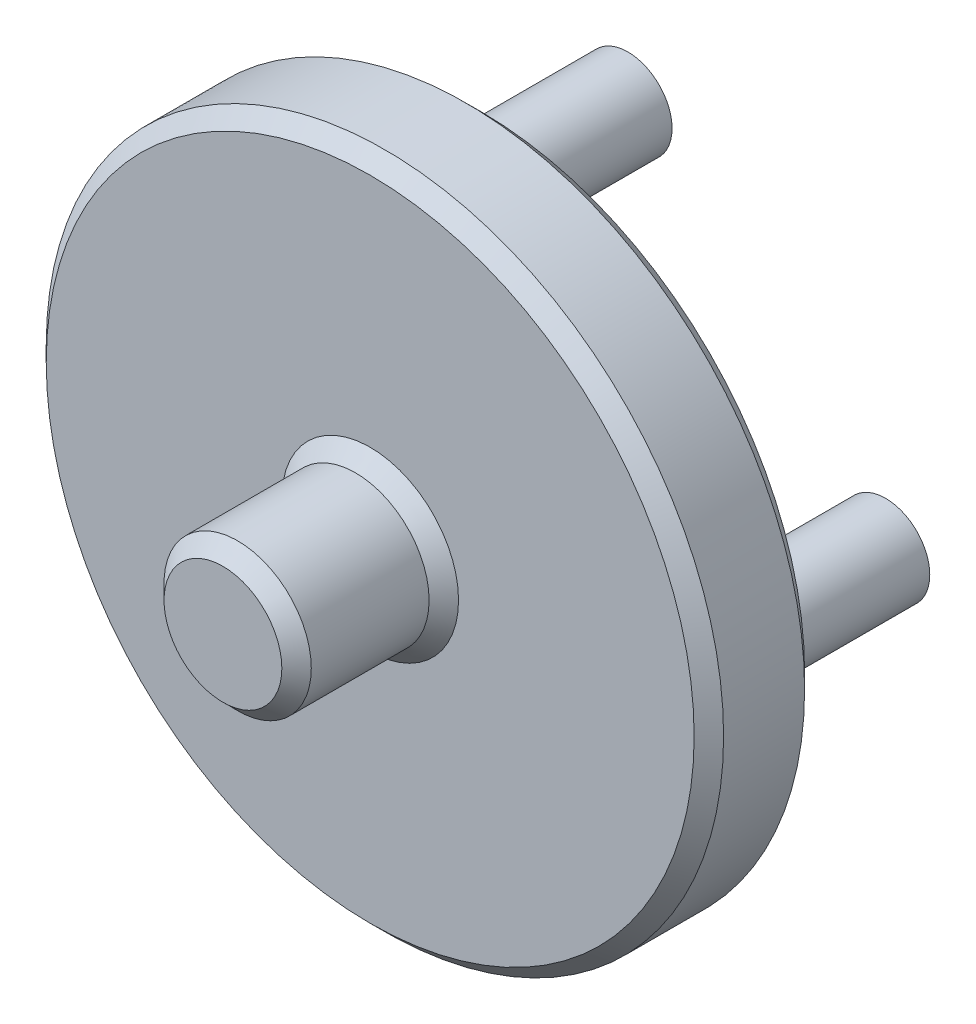
ISO-10303-21;
HEADER;
FILE_DESCRIPTION(('STEP AP214'),'2;1');
FILE_NAME('part.step','',(''),(''),'','','');
FILE_SCHEMA(('AUTOMOTIVE_DESIGN { 1 0 10303 214 1 1 1 1 }'));
ENDSEC;
DATA;
#1=APPLICATION_CONTEXT('core data for automotive mechanical design processes');
#2=APPLICATION_PROTOCOL_DEFINITION('international standard','automotive_design',2000,#1);
#3=PRODUCT_CONTEXT('',#1,'mechanical');
#4=PRODUCT('Part','Part','',(#3));
#5=PRODUCT_RELATED_PRODUCT_CATEGORY('part','',(#4));
#6=PRODUCT_DEFINITION_FORMATION('','',#4);
#7=PRODUCT_DEFINITION_CONTEXT('part definition',#1,'design');
#8=PRODUCT_DEFINITION('design','',#6,#7);
#9=PRODUCT_DEFINITION_SHAPE('','',#8);
#10=(LENGTH_UNIT() NAMED_UNIT(*) SI_UNIT(.MILLI.,.METRE.));
#11=(NAMED_UNIT(*) PLANE_ANGLE_UNIT() SI_UNIT($,.RADIAN.));
#12=(NAMED_UNIT(*) SI_UNIT($,.STERADIAN.) SOLID_ANGLE_UNIT());
#13=UNCERTAINTY_MEASURE_WITH_UNIT(LENGTH_MEASURE(1.E-05),#10,'distance_accuracy_value','');
#14=(GEOMETRIC_REPRESENTATION_CONTEXT(3) GLOBAL_UNCERTAINTY_ASSIGNED_CONTEXT((#13)) GLOBAL_UNIT_ASSIGNED_CONTEXT((#10,
#11,#12)) REPRESENTATION_CONTEXT('',''));
#15=CARTESIAN_POINT('',(0.,0.,0.));
#16=DIRECTION('',(0.,0.,1.));
#17=DIRECTION('',(1.,0.,0.));
#18=AXIS2_PLACEMENT_3D('',#15,#16,#17);
#19=CARTESIAN_POINT('',(0.,0.,7.5));
#20=DIRECTION('',(0.,0.,-1.));
#21=DIRECTION('',(-1.,0.,0.));
#22=AXIS2_PLACEMENT_3D('',#19,#20,#21);
#23=CYLINDRICAL_SURFACE('',#22,23.);
#24=CARTESIAN_POINT('',(0.,0.,1.00000000000001));
#25=DIRECTION('',(0.,0.,1.));
#26=DIRECTION('',(1.,0.,0.));
#27=AXIS2_PLACEMENT_3D('',#24,#25,#26);
#28=CIRCLE('',#27,23.);
#29=CARTESIAN_POINT('',(23.,0.,1.00000000000001));
#30=VERTEX_POINT('',#29);
#31=EDGE_CURVE('E10',#30,#30,#28,.T.);
#32=ORIENTED_EDGE('',*,*,#31,.T.);
#33=EDGE_LOOP('',(#32));
#34=FACE_BOUND('',#33,.T.);
#35=CARTESIAN_POINT('',(0.,0.,6.49999999999998));
#36=DIRECTION('',(0.,0.,1.));
#37=DIRECTION('',(1.,0.,0.));
#38=AXIS2_PLACEMENT_3D('',#35,#36,#37);
#39=CIRCLE('',#38,23.);
#40=CARTESIAN_POINT('',(23.,0.,6.49999999999998));
#41=VERTEX_POINT('',#40);
#42=EDGE_CURVE('E54',#41,#41,#39,.F.);
#43=ORIENTED_EDGE('',*,*,#42,.T.);
#44=EDGE_LOOP('',(#43));
#45=FACE_BOUND('',#44,.T.);
#46=ADVANCED_FACE('F45',(#34,#45),#23,.T.);
#47=CARTESIAN_POINT('',(0.,0.,7.5));
#48=DIRECTION('',(0.,0.,1.));
#49=DIRECTION('',(1.,0.,0.));
#50=AXIS2_PLACEMENT_3D('',#47,#48,#49);
#51=PLANE('',#50);
#52=CARTESIAN_POINT('',(0.,0.,7.5));
#53=DIRECTION('',(0.,0.,1.));
#54=DIRECTION('',(1.,0.,0.));
#55=AXIS2_PLACEMENT_3D('',#52,#53,#54);
#56=CIRCLE('',#55,6.00000000000001);
#57=CARTESIAN_POINT('',(6.00000000000001,0.,7.5));
#58=VERTEX_POINT('',#57);
#59=EDGE_CURVE('E98',#58,#58,#56,.F.);
#60=ORIENTED_EDGE('',*,*,#59,.T.);
#61=EDGE_LOOP('',(#60));
#62=FACE_BOUND('',#61,.T.);
#63=CARTESIAN_POINT('',(0.,0.,7.5));
#64=DIRECTION('',(0.,0.,1.));
#65=DIRECTION('',(1.,0.,0.));
#66=AXIS2_PLACEMENT_3D('',#63,#64,#65);
#67=CIRCLE('',#66,22.);
#68=CARTESIAN_POINT('',(22.,0.,7.5));
#69=VERTEX_POINT('',#68);
#70=EDGE_CURVE('E102',#69,#69,#67,.T.);
#71=ORIENTED_EDGE('',*,*,#70,.T.);
#72=EDGE_LOOP('',(#71));
#73=FACE_BOUND('',#72,.T.);
#74=ADVANCED_FACE('F153',(#62,#73),#51,.T.);
#75=CARTESIAN_POINT('',(0.,0.,0.));
#76=DIRECTION('',(0.,0.,1.));
#77=DIRECTION('',(1.,0.,0.));
#78=AXIS2_PLACEMENT_3D('',#75,#76,#77);
#79=PLANE('',#78);
#80=CARTESIAN_POINT('',(-1.2220184685951E-13,-17.5,0.));
#81=DIRECTION('',(0.,0.,1.));
#82=DIRECTION('',(1.,0.,0.));
#83=AXIS2_PLACEMENT_3D('',#80,#81,#82);
#84=CIRCLE('',#83,4.);
#85=CARTESIAN_POINT('',(3.99999999999988,-17.5,0.));
#86=VERTEX_POINT('',#85);
#87=EDGE_CURVE('E78',#86,#86,#84,.T.);
#88=ORIENTED_EDGE('',*,*,#87,.T.);
#89=EDGE_LOOP('',(#88));
#90=FACE_BOUND('',#89,.T.);
#91=CARTESIAN_POINT('',(-17.5,1.83302770289265E-13,0.));
#92=DIRECTION('',(0.,0.,1.));
#93=DIRECTION('',(1.,0.,0.));
#94=AXIS2_PLACEMENT_3D('',#91,#92,#93);
#95=CIRCLE('',#94,4.);
#96=CARTESIAN_POINT('',(-13.5,1.83302770289265E-13,0.));
#97=VERTEX_POINT('',#96);
#98=EDGE_CURVE('E82',#97,#97,#95,.T.);
#99=ORIENTED_EDGE('',*,*,#98,.T.);
#100=EDGE_LOOP('',(#99));
#101=FACE_BOUND('',#100,.T.);
#102=CARTESIAN_POINT('',(0.,17.5,0.));
#103=DIRECTION('',(0.,0.,1.));
#104=DIRECTION('',(1.,0.,0.));
#105=AXIS2_PLACEMENT_3D('',#102,#103,#104);
#106=CIRCLE('',#105,4.);
#107=CARTESIAN_POINT('',(4.,17.5,0.));
#108=VERTEX_POINT('',#107);
#109=EDGE_CURVE('E86',#108,#108,#106,.T.);
#110=ORIENTED_EDGE('',*,*,#109,.T.);
#111=EDGE_LOOP('',(#110));
#112=FACE_BOUND('',#111,.T.);
#113=CARTESIAN_POINT('',(17.5,0.,0.));
#114=DIRECTION('',(0.,0.,1.));
#115=DIRECTION('',(1.,0.,0.));
#116=AXIS2_PLACEMENT_3D('',#113,#114,#115);
#117=CIRCLE('',#116,4.);
#118=CARTESIAN_POINT('',(21.5,0.,0.));
#119=VERTEX_POINT('',#118);
#120=EDGE_CURVE('E90',#119,#119,#117,.T.);
#121=ORIENTED_EDGE('',*,*,#120,.T.);
#122=EDGE_LOOP('',(#121));
#123=FACE_BOUND('',#122,.T.);
#124=CARTESIAN_POINT('',(0.,0.,0.));
#125=DIRECTION('',(0.,0.,1.));
#126=DIRECTION('',(1.,0.,0.));
#127=AXIS2_PLACEMENT_3D('',#124,#125,#126);
#128=CIRCLE('',#127,22.);
#129=CARTESIAN_POINT('',(22.,0.,0.));
#130=VERTEX_POINT('',#129);
#131=EDGE_CURVE('E94',#130,#130,#128,.F.);
#132=ORIENTED_EDGE('',*,*,#131,.T.);
#133=EDGE_LOOP('',(#132));
#134=FACE_BOUND('',#133,.T.);
#135=ADVANCED_FACE('F158',(#90,#101,#112,#123,#134),#79,.F.);
#136=CARTESIAN_POINT('',(-17.5,1.83302770289265E-13,-10.));
#137=DIRECTION('',(0.,0.,1.));
#138=DIRECTION('',(1.,0.,0.));
#139=AXIS2_PLACEMENT_3D('',#136,#137,#138);
#140=CYLINDRICAL_SURFACE('',#139,3.);
#141=CARTESIAN_POINT('',(-17.5,1.83302770289265E-13,-1.));
#142=DIRECTION('',(0.,0.,1.));
#143=DIRECTION('',(1.,0.,0.));
#144=AXIS2_PLACEMENT_3D('',#141,#142,#143);
#145=CIRCLE('',#144,3.);
#146=CARTESIAN_POINT('',(-14.5,1.83302770289265E-13,-1.));
#147=VERTEX_POINT('',#146);
#148=EDGE_CURVE('E70',#147,#147,#145,.F.);
#149=ORIENTED_EDGE('',*,*,#148,.T.);
#150=EDGE_LOOP('',(#149));
#151=FACE_BOUND('',#150,.T.);
#152=CARTESIAN_POINT('',(-17.5,1.83302770289265E-13,-10.));
#153=DIRECTION('',(0.,0.,1.));
#154=DIRECTION('',(1.,0.,0.));
#155=AXIS2_PLACEMENT_3D('',#152,#153,#154);
#156=CIRCLE('',#155,3.);
#157=CARTESIAN_POINT('',(-14.5,1.83302770289265E-13,-10.));
#158=VERTEX_POINT('',#157);
#159=EDGE_CURVE('E119',#158,#158,#156,.T.);
#160=ORIENTED_EDGE('',*,*,#159,.T.);
#161=EDGE_LOOP('',(#160));
#162=FACE_BOUND('',#161,.T.);
#163=ADVANCED_FACE('F218',(#151,#162),#140,.T.);
#164=CARTESIAN_POINT('',(-17.5,1.83302770289265E-13,-10.));
#165=DIRECTION('',(0.,0.,1.));
#166=DIRECTION('',(1.,0.,0.));
#167=AXIS2_PLACEMENT_3D('',#164,#165,#166);
#168=PLANE('',#167);
#169=ORIENTED_EDGE('',*,*,#159,.F.);
#170=EDGE_LOOP('',(#169));
#171=FACE_BOUND('',#170,.T.);
#172=ADVANCED_FACE('F223',(#171),#168,.F.);
#173=CARTESIAN_POINT('',(-1.2220184685951E-13,-17.5,-10.));
#174=DIRECTION('',(0.,0.,1.));
#175=DIRECTION('',(1.,0.,0.));
#176=AXIS2_PLACEMENT_3D('',#173,#174,#175);
#177=CYLINDRICAL_SURFACE('',#176,3.);
#178=CARTESIAN_POINT('',(-1.2220184685951E-13,-17.5,-1.));
#179=DIRECTION('',(0.,0.,1.));
#180=DIRECTION('',(1.,0.,0.));
#181=AXIS2_PLACEMENT_3D('',#178,#179,#180);
#182=CIRCLE('',#181,3.);
#183=CARTESIAN_POINT('',(2.99999999999988,-17.5,-1.));
#184=VERTEX_POINT('',#183);
#185=EDGE_CURVE('E74',#184,#184,#182,.F.);
#186=ORIENTED_EDGE('',*,*,#185,.T.);
#187=EDGE_LOOP('',(#186));
#188=FACE_BOUND('',#187,.T.);
#189=CARTESIAN_POINT('',(-1.2220184685951E-13,-17.5,-10.));
#190=DIRECTION('',(0.,0.,1.));
#191=DIRECTION('',(1.,0.,0.));
#192=AXIS2_PLACEMENT_3D('',#189,#190,#191);
#193=CIRCLE('',#192,3.);
#194=CARTESIAN_POINT('',(2.99999999999988,-17.5,-10.));
#195=VERTEX_POINT('',#194);
#196=EDGE_CURVE('E123',#195,#195,#193,.T.);
#197=ORIENTED_EDGE('',*,*,#196,.T.);
#198=EDGE_LOOP('',(#197));
#199=FACE_BOUND('',#198,.T.);
#200=ADVANCED_FACE('F241',(#188,#199),#177,.T.);
#201=CARTESIAN_POINT('',(-1.2220184685951E-13,-17.5,-10.));
#202=DIRECTION('',(0.,0.,1.));
#203=DIRECTION('',(1.,0.,0.));
#204=AXIS2_PLACEMENT_3D('',#201,#202,#203);
#205=PLANE('',#204);
#206=ORIENTED_EDGE('',*,*,#196,.F.);
#207=EDGE_LOOP('',(#206));
#208=FACE_BOUND('',#207,.T.);
#209=ADVANCED_FACE('F246',(#208),#205,.F.);
#210=CARTESIAN_POINT('',(17.5,0.,-10.));
#211=DIRECTION('',(0.,0.,1.));
#212=DIRECTION('',(1.,0.,0.));
#213=AXIS2_PLACEMENT_3D('',#210,#211,#212);
#214=CYLINDRICAL_SURFACE('',#213,3.);
#215=CARTESIAN_POINT('',(17.5,0.,-1.));
#216=DIRECTION('',(0.,0.,1.));
#217=DIRECTION('',(1.,0.,0.));
#218=AXIS2_PLACEMENT_3D('',#215,#216,#217);
#219=CIRCLE('',#218,3.);
#220=CARTESIAN_POINT('',(20.5,0.,-1.));
#221=VERTEX_POINT('',#220);
#222=EDGE_CURVE('E59',#221,#221,#219,.F.);
#223=ORIENTED_EDGE('',*,*,#222,.T.);
#224=EDGE_LOOP('',(#223));
#225=FACE_BOUND('',#224,.T.);
#226=CARTESIAN_POINT('',(17.5,0.,-10.));
#227=DIRECTION('',(0.,0.,1.));
#228=DIRECTION('',(1.,0.,0.));
#229=AXIS2_PLACEMENT_3D('',#226,#227,#228);
#230=CIRCLE('',#229,3.);
#231=CARTESIAN_POINT('',(20.5,0.,-10.));
#232=VERTEX_POINT('',#231);
#233=EDGE_CURVE('E127',#232,#232,#230,.T.);
#234=ORIENTED_EDGE('',*,*,#233,.T.);
#235=EDGE_LOOP('',(#234));
#236=FACE_BOUND('',#235,.T.);
#237=ADVANCED_FACE('F249',(#225,#236),#214,.T.);
#238=CARTESIAN_POINT('',(17.5,0.,-10.));
#239=DIRECTION('',(0.,0.,1.));
#240=DIRECTION('',(1.,0.,0.));
#241=AXIS2_PLACEMENT_3D('',#238,#239,#240);
#242=PLANE('',#241);
#243=ORIENTED_EDGE('',*,*,#233,.F.);
#244=EDGE_LOOP('',(#243));
#245=FACE_BOUND('',#244,.T.);
#246=ADVANCED_FACE('F150',(#245),#242,.F.);
#247=CARTESIAN_POINT('',(0.,17.5,-10.));
#248=DIRECTION('',(0.,0.,1.));
#249=DIRECTION('',(1.,0.,0.));
#250=AXIS2_PLACEMENT_3D('',#247,#248,#249);
#251=CYLINDRICAL_SURFACE('',#250,3.);
#252=CARTESIAN_POINT('',(0.,17.5,-0.999999999999999));
#253=DIRECTION('',(0.,0.,1.));
#254=DIRECTION('',(1.,0.,0.));
#255=AXIS2_PLACEMENT_3D('',#252,#253,#254);
#256=CIRCLE('',#255,3.);
#257=CARTESIAN_POINT('',(3.,17.5,-0.999999999999999));
#258=VERTEX_POINT('',#257);
#259=EDGE_CURVE('E64',#258,#258,#256,.F.);
#260=ORIENTED_EDGE('',*,*,#259,.T.);
#261=EDGE_LOOP('',(#260));
#262=FACE_BOUND('',#261,.T.);
#263=CARTESIAN_POINT('',(0.,17.5,-10.));
#264=DIRECTION('',(0.,0.,1.));
#265=DIRECTION('',(1.,0.,0.));
#266=AXIS2_PLACEMENT_3D('',#263,#264,#265);
#267=CIRCLE('',#266,3.);
#268=CARTESIAN_POINT('',(3.,17.5,-10.));
#269=VERTEX_POINT('',#268);
#270=EDGE_CURVE('E118',#269,#269,#267,.T.);
#271=ORIENTED_EDGE('',*,*,#270,.T.);
#272=EDGE_LOOP('',(#271));
#273=FACE_BOUND('',#272,.T.);
#274=ADVANCED_FACE('F135',(#262,#273),#251,.T.);
#275=CARTESIAN_POINT('',(0.,17.5,-10.));
#276=DIRECTION('',(0.,0.,1.));
#277=DIRECTION('',(1.,0.,0.));
#278=AXIS2_PLACEMENT_3D('',#275,#276,#277);
#279=PLANE('',#278);
#280=ORIENTED_EDGE('',*,*,#270,.F.);
#281=EDGE_LOOP('',(#280));
#282=FACE_BOUND('',#281,.T.);
#283=ADVANCED_FACE('F137',(#282),#279,.F.);
#284=CARTESIAN_POINT('',(0.,0.,17.5));
#285=DIRECTION('',(0.,0.,-1.));
#286=DIRECTION('',(-1.,0.,0.));
#287=AXIS2_PLACEMENT_3D('',#284,#285,#286);
#288=CYLINDRICAL_SURFACE('',#287,5.);
#289=CARTESIAN_POINT('',(0.,0.,16.5));
#290=DIRECTION('',(0.,0.,1.));
#291=DIRECTION('',(1.,0.,0.));
#292=AXIS2_PLACEMENT_3D('',#289,#290,#291);
#293=CIRCLE('',#292,5.);
#294=CARTESIAN_POINT('',(5.,0.,16.5));
#295=VERTEX_POINT('',#294);
#296=EDGE_CURVE('E106',#295,#295,#293,.F.);
#297=ORIENTED_EDGE('',*,*,#296,.T.);
#298=EDGE_LOOP('',(#297));
#299=FACE_BOUND('',#298,.T.);
#300=CARTESIAN_POINT('',(0.,0.,8.50000000000002));
#301=DIRECTION('',(0.,0.,1.));
#302=DIRECTION('',(1.,0.,0.));
#303=AXIS2_PLACEMENT_3D('',#300,#301,#302);
#304=CIRCLE('',#303,5.);
#305=CARTESIAN_POINT('',(5.,0.,8.50000000000002));
#306=VERTEX_POINT('',#305);
#307=EDGE_CURVE('E110',#306,#306,#304,.T.);
#308=ORIENTED_EDGE('',*,*,#307,.T.);
#309=EDGE_LOOP('',(#308));
#310=FACE_BOUND('',#309,.T.);
#311=ADVANCED_FACE('F139',(#299,#310),#288,.T.);
#312=CARTESIAN_POINT('',(0.,0.,17.5));
#313=DIRECTION('',(0.,0.,1.));
#314=DIRECTION('',(1.,0.,0.));
#315=AXIS2_PLACEMENT_3D('',#312,#313,#314);
#316=PLANE('',#315);
#317=CARTESIAN_POINT('',(0.,0.,17.5));
#318=DIRECTION('',(0.,0.,1.));
#319=DIRECTION('',(1.,0.,0.));
#320=AXIS2_PLACEMENT_3D('',#317,#318,#319);
#321=CIRCLE('',#320,3.99999999999999);
#322=CARTESIAN_POINT('',(3.99999999999999,0.,17.5));
#323=VERTEX_POINT('',#322);
#324=EDGE_CURVE('E114',#323,#323,#321,.T.);
#325=ORIENTED_EDGE('',*,*,#324,.T.);
#326=EDGE_LOOP('',(#325));
#327=FACE_BOUND('',#326,.T.);
#328=ADVANCED_FACE('F146',(#327),#316,.T.);
#329=CARTESIAN_POINT('',(0.,0.,17.5));
#330=DIRECTION('',(0.,0.,-1.));
#331=DIRECTION('',(-1.,0.,0.));
#332=AXIS2_PLACEMENT_3D('',#329,#330,#331);
#333=CONICAL_SURFACE('',#332,3.99999999999999,0.785398163397446);
#334=ORIENTED_EDGE('',*,*,#296,.F.);
#335=EDGE_LOOP('',(#334));
#336=FACE_BOUND('',#335,.T.);
#337=ORIENTED_EDGE('',*,*,#324,.F.);
#338=EDGE_LOOP('',(#337));
#339=FACE_BOUND('',#338,.T.);
#340=ADVANCED_FACE('F164',(#336,#339),#333,.T.);
#341=CARTESIAN_POINT('',(0.,0.,8.50000000000002));
#342=DIRECTION('',(0.,0.,-1.));
#343=DIRECTION('',(-1.,0.,0.));
#344=AXIS2_PLACEMENT_3D('',#341,#342,#343);
#345=CONICAL_SURFACE('',#344,5.,0.78539816339744);
#346=ORIENTED_EDGE('',*,*,#59,.F.);
#347=EDGE_LOOP('',(#346));
#348=FACE_BOUND('',#347,.T.);
#349=ORIENTED_EDGE('',*,*,#307,.F.);
#350=EDGE_LOOP('',(#349));
#351=FACE_BOUND('',#350,.T.);
#352=ADVANCED_FACE('F170',(#348,#351),#345,.T.);
#353=CARTESIAN_POINT('',(-1.2220184685951E-13,-17.5,0.));
#354=DIRECTION('',(0.,0.,1.));
#355=DIRECTION('',(1.,0.,0.));
#356=AXIS2_PLACEMENT_3D('',#353,#354,#355);
#357=CONICAL_SURFACE('',#356,4.,0.78539816339745);
#358=ORIENTED_EDGE('',*,*,#185,.F.);
#359=EDGE_LOOP('',(#358));
#360=FACE_BOUND('',#359,.T.);
#361=ORIENTED_EDGE('',*,*,#87,.F.);
#362=EDGE_LOOP('',(#361));
#363=FACE_BOUND('',#362,.T.);
#364=ADVANCED_FACE('F177',(#360,#363),#357,.T.);
#365=CARTESIAN_POINT('',(-17.5,1.83302770289265E-13,0.));
#366=DIRECTION('',(0.,0.,1.));
#367=DIRECTION('',(1.,0.,0.));
#368=AXIS2_PLACEMENT_3D('',#365,#366,#367);
#369=CONICAL_SURFACE('',#368,4.,0.78539816339745);
#370=ORIENTED_EDGE('',*,*,#148,.F.);
#371=EDGE_LOOP('',(#370));
#372=FACE_BOUND('',#371,.T.);
#373=ORIENTED_EDGE('',*,*,#98,.F.);
#374=EDGE_LOOP('',(#373));
#375=FACE_BOUND('',#374,.T.);
#376=ADVANCED_FACE('F184',(#372,#375),#369,.T.);
#377=CARTESIAN_POINT('',(0.,17.5,0.));
#378=DIRECTION('',(0.,0.,1.));
#379=DIRECTION('',(1.,0.,0.));
#380=AXIS2_PLACEMENT_3D('',#377,#378,#379);
#381=CONICAL_SURFACE('',#380,4.,0.78539816339745);
#382=ORIENTED_EDGE('',*,*,#259,.F.);
#383=EDGE_LOOP('',(#382));
#384=FACE_BOUND('',#383,.T.);
#385=ORIENTED_EDGE('',*,*,#109,.F.);
#386=EDGE_LOOP('',(#385));
#387=FACE_BOUND('',#386,.T.);
#388=ADVANCED_FACE('F191',(#384,#387),#381,.T.);
#389=CARTESIAN_POINT('',(17.5,0.,0.));
#390=DIRECTION('',(0.,0.,1.));
#391=DIRECTION('',(1.,0.,0.));
#392=AXIS2_PLACEMENT_3D('',#389,#390,#391);
#393=CONICAL_SURFACE('',#392,4.,0.78539816339745);
#394=ORIENTED_EDGE('',*,*,#222,.F.);
#395=EDGE_LOOP('',(#394));
#396=FACE_BOUND('',#395,.T.);
#397=ORIENTED_EDGE('',*,*,#120,.F.);
#398=EDGE_LOOP('',(#397));
#399=FACE_BOUND('',#398,.T.);
#400=ADVANCED_FACE('F198',(#396,#399),#393,.T.);
#401=CARTESIAN_POINT('',(0.,0.,1.00000000000001));
#402=DIRECTION('',(0.,0.,1.));
#403=DIRECTION('',(1.,0.,0.));
#404=AXIS2_PLACEMENT_3D('',#401,#402,#403);
#405=CONICAL_SURFACE('',#404,23.,0.785398163397448);
#406=ORIENTED_EDGE('',*,*,#131,.F.);
#407=EDGE_LOOP('',(#406));
#408=FACE_BOUND('',#407,.T.);
#409=ORIENTED_EDGE('',*,*,#31,.F.);
#410=EDGE_LOOP('',(#409));
#411=FACE_BOUND('',#410,.T.);
#412=ADVANCED_FACE('F204',(#408,#411),#405,.T.);
#413=CARTESIAN_POINT('',(0.,0.,7.5));
#414=DIRECTION('',(0.,0.,-1.));
#415=DIRECTION('',(-1.,0.,0.));
#416=AXIS2_PLACEMENT_3D('',#413,#414,#415);
#417=CONICAL_SURFACE('',#416,22.,0.785398163397445);
#418=ORIENTED_EDGE('',*,*,#42,.F.);
#419=EDGE_LOOP('',(#418));
#420=FACE_BOUND('',#419,.T.);
#421=ORIENTED_EDGE('',*,*,#70,.F.);
#422=EDGE_LOOP('',(#421));
#423=FACE_BOUND('',#422,.T.);
#424=ADVANCED_FACE('F48',(#420,#423),#417,.T.);
#425=CLOSED_SHELL('',(#46,#74,#135,#163,#172,#200,#209,#237,#246,#274,#283,#311,#328,#340,#352,
#364,#376,#388,#400,#412,#424));
#426=MANIFOLD_SOLID_BREP('B2',#425);
#427=ADVANCED_BREP_SHAPE_REPRESENTATION('',(#18,#426),#14);
#428=SHAPE_DEFINITION_REPRESENTATION(#9,#427);
ENDSEC;
END-ISO-10303-21;
